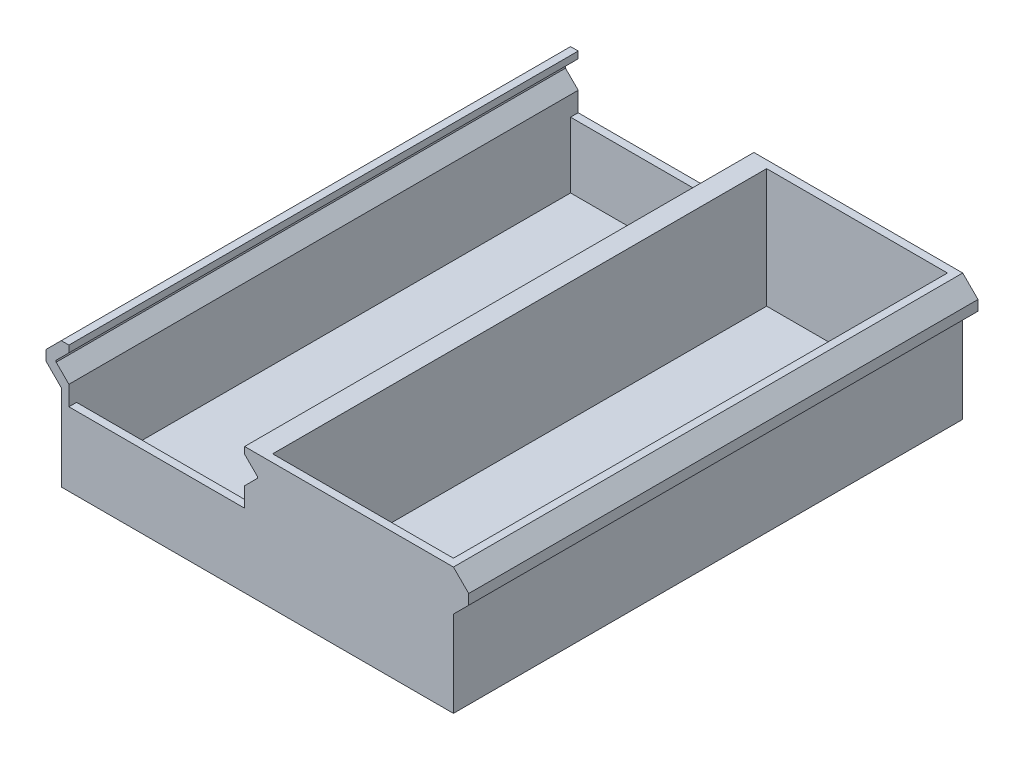
ISO-10303-21;
HEADER;
FILE_DESCRIPTION(('STEP AP214'),'2;1');
FILE_NAME('part.step','',(''),(''),'','','');
FILE_SCHEMA(('AUTOMOTIVE_DESIGN { 1 0 10303 214 1 1 1 1 }'));
ENDSEC;
DATA;
#1=APPLICATION_CONTEXT('core data for automotive mechanical design processes');
#2=APPLICATION_PROTOCOL_DEFINITION('international standard','automotive_design',2000,#1);
#3=PRODUCT_CONTEXT('',#1,'mechanical');
#4=PRODUCT('Part','Part','',(#3));
#5=PRODUCT_RELATED_PRODUCT_CATEGORY('part','',(#4));
#6=PRODUCT_DEFINITION_FORMATION('','',#4);
#7=PRODUCT_DEFINITION_CONTEXT('part definition',#1,'design');
#8=PRODUCT_DEFINITION('design','',#6,#7);
#9=PRODUCT_DEFINITION_SHAPE('','',#8);
#10=(LENGTH_UNIT() NAMED_UNIT(*) SI_UNIT(.MILLI.,.METRE.));
#11=(NAMED_UNIT(*) PLANE_ANGLE_UNIT() SI_UNIT($,.RADIAN.));
#12=(NAMED_UNIT(*) SI_UNIT($,.STERADIAN.) SOLID_ANGLE_UNIT());
#13=UNCERTAINTY_MEASURE_WITH_UNIT(LENGTH_MEASURE(1.E-05),#10,'distance_accuracy_value','');
#14=(GEOMETRIC_REPRESENTATION_CONTEXT(3) GLOBAL_UNCERTAINTY_ASSIGNED_CONTEXT((#13)) GLOBAL_UNIT_ASSIGNED_CONTEXT((#10,
#11,#12)) REPRESENTATION_CONTEXT('',''));
#15=CARTESIAN_POINT('',(0.,0.,0.));
#16=DIRECTION('',(0.,0.,1.));
#17=DIRECTION('',(1.,0.,0.));
#18=AXIS2_PLACEMENT_3D('',#15,#16,#17);
#19=CARTESIAN_POINT('',(-77.,49.7790066638099,-200.));
#20=DIRECTION('',(0.,-1.,0.));
#21=DIRECTION('',(1.,0.,0.));
#22=AXIS2_PLACEMENT_3D('',#19,#20,#21);
#23=PLANE('',#22);
#24=DIRECTION('',(0.,0.,1.));
#25=VECTOR('',#24,1.);
#26=CARTESIAN_POINT('',(3.,49.7790066638099,-3.));
#27=LINE('',#26,#25);
#28=CARTESIAN_POINT('',(3.,49.7790066638099,-197.));
#29=VERTEX_POINT('',#28);
#30=CARTESIAN_POINT('',(3.,49.7790066638099,-3.));
#31=VERTEX_POINT('',#30);
#32=EDGE_CURVE('E251',#29,#31,#27,.T.);
#33=ORIENTED_EDGE('',*,*,#32,.F.);
#34=DIRECTION('',(-1.,0.,0.));
#35=VECTOR('',#34,1.);
#36=CARTESIAN_POINT('',(74.,49.7790066638099,-197.));
#37=LINE('',#36,#35);
#38=CARTESIAN_POINT('',(74.,49.7790066638099,-197.));
#39=VERTEX_POINT('',#38);
#40=EDGE_CURVE('E57',#39,#29,#37,.T.);
#41=ORIENTED_EDGE('',*,*,#40,.F.);
#42=DIRECTION('',(0.,0.,-1.));
#43=VECTOR('',#42,1.);
#44=CARTESIAN_POINT('',(74.,49.7790066638099,-3.));
#45=LINE('',#44,#43);
#46=CARTESIAN_POINT('',(74.,49.7790066638099,-3.));
#47=VERTEX_POINT('',#46);
#48=EDGE_CURVE('E491',#47,#39,#45,.T.);
#49=ORIENTED_EDGE('',*,*,#48,.F.);
#50=DIRECTION('',(1.,0.,0.));
#51=VECTOR('',#50,1.);
#52=CARTESIAN_POINT('',(-74.,49.7790066638099,-3.));
#53=LINE('',#52,#51);
#54=EDGE_CURVE('E250',#31,#47,#53,.T.);
#55=ORIENTED_EDGE('',*,*,#54,.F.);
#56=EDGE_LOOP('',(#33,#41,#49,#55));
#57=FACE_BOUND('',#56,.T.);
#58=DIRECTION('',(1.,0.,0.));
#59=VECTOR('',#58,1.);
#60=CARTESIAN_POINT('',(-77.,49.7790066638099,-200.));
#61=LINE('',#60,#59);
#62=CARTESIAN_POINT('',(-5.,49.7790066638099,-200.));
#63=VERTEX_POINT('',#62);
#64=CARTESIAN_POINT('',(77.,49.77900666381,-200.));
#65=VERTEX_POINT('',#64);
#66=EDGE_CURVE('E271',#63,#65,#61,.T.);
#67=ORIENTED_EDGE('',*,*,#66,.F.);
#68=DIRECTION('',(0.,0.,1.));
#69=VECTOR('',#68,1.);
#70=CARTESIAN_POINT('',(-5.,49.7790066638099,-3.));
#71=LINE('',#70,#69);
#72=CARTESIAN_POINT('',(-5.,49.7790066638099,0.));
#73=VERTEX_POINT('',#72);
#74=EDGE_CURVE('E452',#63,#73,#71,.T.);
#75=ORIENTED_EDGE('',*,*,#74,.T.);
#76=DIRECTION('',(1.,0.,0.));
#77=VECTOR('',#76,1.);
#78=CARTESIAN_POINT('',(-77.,49.7790066638099,0.));
#79=LINE('',#78,#77);
#80=CARTESIAN_POINT('',(77.,49.77900666381,0.));
#81=VERTEX_POINT('',#80);
#82=EDGE_CURVE('E309',#73,#81,#79,.T.);
#83=ORIENTED_EDGE('',*,*,#82,.T.);
#84=DIRECTION('',(0.,0.,1.));
#85=VECTOR('',#84,1.);
#86=CARTESIAN_POINT('',(77.,49.77900666381,-200.));
#87=LINE('',#86,#85);
#88=EDGE_CURVE('E368',#65,#81,#87,.T.);
#89=ORIENTED_EDGE('',*,*,#88,.F.);
#90=EDGE_LOOP('',(#67,#75,#83,#89));
#91=FACE_BOUND('',#90,.T.);
#92=ADVANCED_FACE('F41',(#57,#91),#23,.F.);
#93=CARTESIAN_POINT('',(-5.,243.943885053286,-3.));
#94=DIRECTION('',(-1.,0.,0.));
#95=DIRECTION('',(0.,0.,1.));
#96=AXIS2_PLACEMENT_3D('',#93,#94,#95);
#97=PLANE('',#96);
#98=DIRECTION('',(0.,0.,-1.));
#99=VECTOR('',#98,1.);
#100=CARTESIAN_POINT('',(-5.,47.1221524143175,-3.));
#101=LINE('',#100,#99);
#102=CARTESIAN_POINT('',(-5.,47.1221524143175,0.));
#103=VERTEX_POINT('',#102);
#104=CARTESIAN_POINT('',(-5.,47.1221524143175,-200.));
#105=VERTEX_POINT('',#104);
#106=EDGE_CURVE('E12',#103,#105,#101,.T.);
#107=ORIENTED_EDGE('',*,*,#106,.F.);
#108=DIRECTION('',(0.,1.,0.));
#109=VECTOR('',#108,1.);
#110=CARTESIAN_POINT('',(-5.,47.1221524143175,0.));
#111=LINE('',#110,#109);
#112=EDGE_CURVE('E262',#103,#73,#111,.T.);
#113=ORIENTED_EDGE('',*,*,#112,.T.);
#114=ORIENTED_EDGE('',*,*,#74,.F.);
#115=DIRECTION('',(0.,1.,0.));
#116=VECTOR('',#115,1.);
#117=CARTESIAN_POINT('',(-5.,47.1221524143175,-200.));
#118=LINE('',#117,#116);
#119=EDGE_CURVE('E443',#105,#63,#118,.T.);
#120=ORIENTED_EDGE('',*,*,#119,.F.);
#121=EDGE_LOOP('',(#107,#113,#114,#120));
#122=FACE_BOUND('',#121,.T.);
#123=ADVANCED_FACE('F642',(#122),#97,.T.);
#124=CARTESIAN_POINT('',(74.,-244.008196583639,-197.));
#125=DIRECTION('',(0.,0.,-1.));
#126=DIRECTION('',(-1.,0.,0.));
#127=AXIS2_PLACEMENT_3D('',#124,#125,#126);
#128=PLANE('',#127);
#129=DIRECTION('',(0.,-1.,0.));
#130=VECTOR('',#129,1.);
#131=CARTESIAN_POINT('',(3.,243.943885053286,-197.));
#132=LINE('',#131,#130);
#133=CARTESIAN_POINT('',(3.,2.99999999999999,-197.));
#134=VERTEX_POINT('',#133);
#135=EDGE_CURVE('E455',#29,#134,#132,.T.);
#136=ORIENTED_EDGE('',*,*,#135,.T.);
#137=DIRECTION('',(1.,0.,0.));
#138=VECTOR('',#137,1.);
#139=CARTESIAN_POINT('',(74.,3.,-197.));
#140=LINE('',#139,#138);
#141=CARTESIAN_POINT('',(74.,3.,-197.));
#142=VERTEX_POINT('',#141);
#143=EDGE_CURVE('E479',#134,#142,#140,.T.);
#144=ORIENTED_EDGE('',*,*,#143,.T.);
#145=DIRECTION('',(0.,1.,0.));
#146=VECTOR('',#145,1.);
#147=CARTESIAN_POINT('',(74.,-244.008196583639,-197.));
#148=LINE('',#147,#146);
#149=EDGE_CURVE('E501',#142,#39,#148,.T.);
#150=ORIENTED_EDGE('',*,*,#149,.T.);
#151=ORIENTED_EDGE('',*,*,#40,.T.);
#152=EDGE_LOOP('',(#136,#144,#150,#151));
#153=FACE_BOUND('',#152,.T.);
#154=ADVANCED_FACE('F673',(#153),#128,.F.);
#155=CARTESIAN_POINT('',(-73.9999999999999,-244.008196583639,-3.));
#156=DIRECTION('',(0.,0.,1.));
#157=DIRECTION('',(1.,0.,0.));
#158=AXIS2_PLACEMENT_3D('',#155,#156,#157);
#159=PLANE('',#158);
#160=DIRECTION('',(0.,-1.,0.));
#161=VECTOR('',#160,1.);
#162=CARTESIAN_POINT('',(3.,243.943885053286,-3.));
#163=LINE('',#162,#161);
#164=CARTESIAN_POINT('',(3.,2.99999999999998,-3.));
#165=VERTEX_POINT('',#164);
#166=EDGE_CURVE('E65',#31,#165,#163,.T.);
#167=ORIENTED_EDGE('',*,*,#166,.F.);
#168=ORIENTED_EDGE('',*,*,#54,.T.);
#169=DIRECTION('',(0.,1.,0.));
#170=VECTOR('',#169,1.);
#171=CARTESIAN_POINT('',(74.,-244.008196583639,-3.));
#172=LINE('',#171,#170);
#173=CARTESIAN_POINT('',(74.,2.99999999999998,-3.));
#174=VERTEX_POINT('',#173);
#175=EDGE_CURVE('E504',#174,#47,#172,.T.);
#176=ORIENTED_EDGE('',*,*,#175,.F.);
#177=DIRECTION('',(-1.,0.,0.));
#178=VECTOR('',#177,1.);
#179=CARTESIAN_POINT('',(-74.,2.99999999999998,-3.));
#180=LINE('',#179,#178);
#181=EDGE_CURVE('E310',#174,#165,#180,.T.);
#182=ORIENTED_EDGE('',*,*,#181,.T.);
#183=EDGE_LOOP('',(#167,#168,#176,#182));
#184=FACE_BOUND('',#183,.T.);
#185=ADVANCED_FACE('F685',(#184),#159,.F.);
#186=CARTESIAN_POINT('',(77.,3.,-200.));
#187=DIRECTION('',(0.,1.,0.));
#188=DIRECTION('',(-1.,0.,0.));
#189=AXIS2_PLACEMENT_3D('',#186,#187,#188);
#190=PLANE('',#189);
#191=ORIENTED_EDGE('',*,*,#143,.F.);
#192=DIRECTION('',(0.,0.,-1.));
#193=VECTOR('',#192,1.);
#194=CARTESIAN_POINT('',(3.,2.99999999999999,-3.));
#195=LINE('',#194,#193);
#196=EDGE_CURVE('E451',#165,#134,#195,.T.);
#197=ORIENTED_EDGE('',*,*,#196,.F.);
#198=ORIENTED_EDGE('',*,*,#181,.F.);
#199=DIRECTION('',(0.,0.,1.));
#200=VECTOR('',#199,1.);
#201=CARTESIAN_POINT('',(74.,3.,-3.));
#202=LINE('',#201,#200);
#203=EDGE_CURVE('E476',#142,#174,#202,.T.);
#204=ORIENTED_EDGE('',*,*,#203,.F.);
#205=EDGE_LOOP('',(#191,#197,#198,#204));
#206=FACE_BOUND('',#205,.T.);
#207=ADVANCED_FACE('F681',(#206),#190,.T.);
#208=CARTESIAN_POINT('',(-83.,43.7790066638099,-200.));
#209=DIRECTION('',(0.707106781186549,-0.707106781186546,0.));
#210=DIRECTION('',(0.707106781186546,0.707106781186549,0.));
#211=AXIS2_PLACEMENT_3D('',#208,#209,#210);
#212=PLANE('',#211);
#213=DIRECTION('',(0.707106781186546,0.707106781186549,0.));
#214=VECTOR('',#213,1.);
#215=CARTESIAN_POINT('',(-83.,43.7790066638099,0.));
#216=LINE('',#215,#214);
#217=CARTESIAN_POINT('',(-83.,43.7790066638099,0.));
#218=VERTEX_POINT('',#217);
#219=CARTESIAN_POINT('',(-77.,49.7790066638099,0.));
#220=VERTEX_POINT('',#219);
#221=EDGE_CURVE('E305',#218,#220,#216,.T.);
#222=ORIENTED_EDGE('',*,*,#221,.T.);
#223=DIRECTION('',(0.,0.,1.));
#224=VECTOR('',#223,1.);
#225=CARTESIAN_POINT('',(-77.,49.7790066638099,-200.));
#226=LINE('',#225,#224);
#227=CARTESIAN_POINT('',(-77.,49.7790066638099,-200.));
#228=VERTEX_POINT('',#227);
#229=EDGE_CURVE('E372',#228,#220,#226,.T.);
#230=ORIENTED_EDGE('',*,*,#229,.F.);
#231=DIRECTION('',(0.707106781186546,0.707106781186549,0.));
#232=VECTOR('',#231,1.);
#233=CARTESIAN_POINT('',(-83.,43.7790066638099,-200.));
#234=LINE('',#233,#232);
#235=CARTESIAN_POINT('',(-83.,43.7790066638099,-200.));
#236=VERTEX_POINT('',#235);
#237=EDGE_CURVE('E267',#236,#228,#234,.T.);
#238=ORIENTED_EDGE('',*,*,#237,.F.);
#239=DIRECTION('',(0.,0.,1.));
#240=VECTOR('',#239,1.);
#241=CARTESIAN_POINT('',(-83.,43.7790066638099,-200.));
#242=LINE('',#241,#240);
#243=EDGE_CURVE('E304',#236,#218,#242,.T.);
#244=ORIENTED_EDGE('',*,*,#243,.T.);
#245=EDGE_LOOP('',(#222,#230,#238,#244));
#246=FACE_BOUND('',#245,.T.);
#247=ADVANCED_FACE('F43',(#246),#212,.F.);
#248=CARTESIAN_POINT('',(-74.,49.7790066638099,0.));
#249=VERTEX_POINT('',#248);
#250=EDGE_CURVE('E245',#220,#249,#79,.T.);
#251=ORIENTED_EDGE('',*,*,#250,.T.);
#252=DIRECTION('',(0.,0.,1.));
#253=VECTOR('',#252,1.);
#254=CARTESIAN_POINT('',(-74.,49.7790066638099,-197.));
#255=LINE('',#254,#253);
#256=CARTESIAN_POINT('',(-74.,49.7790066638099,-200.));
#257=VERTEX_POINT('',#256);
#258=EDGE_CURVE('E238',#257,#249,#255,.T.);
#259=ORIENTED_EDGE('',*,*,#258,.F.);
#260=EDGE_CURVE('E243',#228,#257,#61,.T.);
#261=ORIENTED_EDGE('',*,*,#260,.F.);
#262=ORIENTED_EDGE('',*,*,#229,.T.);
#263=EDGE_LOOP('',(#251,#259,#261,#262));
#264=FACE_BOUND('',#263,.T.);
#265=ADVANCED_FACE('F240',(#264),#23,.F.);
#266=CARTESIAN_POINT('',(83.,43.7790066638099,-200.));
#267=DIRECTION('',(0.707106781186549,0.707106781186546,0.));
#268=DIRECTION('',(-0.707106781186546,0.707106781186549,0.));
#269=AXIS2_PLACEMENT_3D('',#266,#267,#268);
#270=PLANE('',#269);
#271=DIRECTION('',(-0.707106781186546,0.707106781186549,0.));
#272=VECTOR('',#271,1.);
#273=CARTESIAN_POINT('',(83.,43.7790066638099,0.));
#274=LINE('',#273,#272);
#275=CARTESIAN_POINT('',(83.,43.7790066638099,0.));
#276=VERTEX_POINT('',#275);
#277=EDGE_CURVE('E313',#276,#81,#274,.T.);
#278=ORIENTED_EDGE('',*,*,#277,.F.);
#279=DIRECTION('',(0.,0.,1.));
#280=VECTOR('',#279,1.);
#281=CARTESIAN_POINT('',(83.,43.7790066638099,-200.));
#282=LINE('',#281,#280);
#283=CARTESIAN_POINT('',(83.,43.7790066638099,-200.));
#284=VERTEX_POINT('',#283);
#285=EDGE_CURVE('E365',#284,#276,#282,.T.);
#286=ORIENTED_EDGE('',*,*,#285,.F.);
#287=DIRECTION('',(-0.707106781186546,0.707106781186549,0.));
#288=VECTOR('',#287,1.);
#289=CARTESIAN_POINT('',(83.,43.7790066638099,-200.));
#290=LINE('',#289,#288);
#291=EDGE_CURVE('E270',#284,#65,#290,.T.);
#292=ORIENTED_EDGE('',*,*,#291,.T.);
#293=ORIENTED_EDGE('',*,*,#88,.T.);
#294=EDGE_LOOP('',(#278,#286,#292,#293));
#295=FACE_BOUND('',#294,.T.);
#296=ADVANCED_FACE('F635',(#295),#270,.T.);
#297=CARTESIAN_POINT('',(83.,39.7790066638099,-200.));
#298=DIRECTION('',(1.,0.,0.));
#299=DIRECTION('',(0.,0.,-1.));
#300=AXIS2_PLACEMENT_3D('',#297,#298,#299);
#301=PLANE('',#300);
#302=DIRECTION('',(0.,1.,0.));
#303=VECTOR('',#302,1.);
#304=CARTESIAN_POINT('',(83.,39.7790066638099,0.));
#305=LINE('',#304,#303);
#306=CARTESIAN_POINT('',(83.,39.7790066638099,0.));
#307=VERTEX_POINT('',#306);
#308=EDGE_CURVE('E317',#307,#276,#305,.T.);
#309=ORIENTED_EDGE('',*,*,#308,.F.);
#310=DIRECTION('',(0.,0.,1.));
#311=VECTOR('',#310,1.);
#312=CARTESIAN_POINT('',(83.,39.7790066638099,-200.));
#313=LINE('',#312,#311);
#314=CARTESIAN_POINT('',(83.,39.7790066638099,-200.));
#315=VERTEX_POINT('',#314);
#316=EDGE_CURVE('E362',#315,#307,#313,.T.);
#317=ORIENTED_EDGE('',*,*,#316,.F.);
#318=DIRECTION('',(0.,1.,0.));
#319=VECTOR('',#318,1.);
#320=CARTESIAN_POINT('',(83.,39.7790066638099,-200.));
#321=LINE('',#320,#319);
#322=EDGE_CURVE('E276',#315,#284,#321,.T.);
#323=ORIENTED_EDGE('',*,*,#322,.T.);
#324=ORIENTED_EDGE('',*,*,#285,.T.);
#325=EDGE_LOOP('',(#309,#317,#323,#324));
#326=FACE_BOUND('',#325,.T.);
#327=ADVANCED_FACE('F631',(#326),#301,.T.);
#328=CARTESIAN_POINT('',(77.,33.77900666381,-200.));
#329=DIRECTION('',(0.707106781186546,-0.707106781186549,0.));
#330=DIRECTION('',(0.707106781186549,0.707106781186546,0.));
#331=AXIS2_PLACEMENT_3D('',#328,#329,#330);
#332=PLANE('',#331);
#333=DIRECTION('',(0.707106781186549,0.707106781186546,0.));
#334=VECTOR('',#333,1.);
#335=CARTESIAN_POINT('',(77.,33.77900666381,0.));
#336=LINE('',#335,#334);
#337=CARTESIAN_POINT('',(77.,33.77900666381,0.));
#338=VERTEX_POINT('',#337);
#339=EDGE_CURVE('E321',#338,#307,#336,.T.);
#340=ORIENTED_EDGE('',*,*,#339,.F.);
#341=DIRECTION('',(0.,0.,1.));
#342=VECTOR('',#341,1.);
#343=CARTESIAN_POINT('',(77.,33.77900666381,-200.));
#344=LINE('',#343,#342);
#345=CARTESIAN_POINT('',(77.,33.77900666381,-200.));
#346=VERTEX_POINT('',#345);
#347=EDGE_CURVE('E359',#346,#338,#344,.T.);
#348=ORIENTED_EDGE('',*,*,#347,.F.);
#349=DIRECTION('',(0.707106781186549,0.707106781186546,0.));
#350=VECTOR('',#349,1.);
#351=CARTESIAN_POINT('',(77.,33.77900666381,-200.));
#352=LINE('',#351,#350);
#353=EDGE_CURVE('E284',#346,#315,#352,.T.);
#354=ORIENTED_EDGE('',*,*,#353,.T.);
#355=ORIENTED_EDGE('',*,*,#316,.T.);
#356=EDGE_LOOP('',(#340,#348,#354,#355));
#357=FACE_BOUND('',#356,.T.);
#358=ADVANCED_FACE('F626',(#357),#332,.T.);
#359=CARTESIAN_POINT('',(77.,0.,-200.));
#360=DIRECTION('',(1.,0.,0.));
#361=DIRECTION('',(0.,0.,-1.));
#362=AXIS2_PLACEMENT_3D('',#359,#360,#361);
#363=PLANE('',#362);
#364=DIRECTION('',(0.,1.,0.));
#365=VECTOR('',#364,1.);
#366=CARTESIAN_POINT('',(77.,0.,0.));
#367=LINE('',#366,#365);
#368=CARTESIAN_POINT('',(77.,0.,0.));
#369=VERTEX_POINT('',#368);
#370=EDGE_CURVE('E325',#369,#338,#367,.T.);
#371=ORIENTED_EDGE('',*,*,#370,.F.);
#372=DIRECTION('',(0.,0.,1.));
#373=VECTOR('',#372,1.);
#374=CARTESIAN_POINT('',(77.,0.,-200.));
#375=LINE('',#374,#373);
#376=CARTESIAN_POINT('',(77.,0.,-200.));
#377=VERTEX_POINT('',#376);
#378=EDGE_CURVE('E356',#377,#369,#375,.T.);
#379=ORIENTED_EDGE('',*,*,#378,.F.);
#380=DIRECTION('',(0.,1.,0.));
#381=VECTOR('',#380,1.);
#382=CARTESIAN_POINT('',(77.,0.,-200.));
#383=LINE('',#382,#381);
#384=EDGE_CURVE('E288',#377,#346,#383,.T.);
#385=ORIENTED_EDGE('',*,*,#384,.T.);
#386=ORIENTED_EDGE('',*,*,#347,.T.);
#387=EDGE_LOOP('',(#371,#379,#385,#386));
#388=FACE_BOUND('',#387,.T.);
#389=ADVANCED_FACE('F622',(#388),#363,.T.);
#390=CARTESIAN_POINT('',(77.,0.,-200.));
#391=DIRECTION('',(0.,1.,0.));
#392=DIRECTION('',(-1.,0.,0.));
#393=AXIS2_PLACEMENT_3D('',#390,#391,#392);
#394=PLANE('',#393);
#395=DIRECTION('',(-1.,0.,0.));
#396=VECTOR('',#395,1.);
#397=CARTESIAN_POINT('',(77.,0.,0.));
#398=LINE('',#397,#396);
#399=CARTESIAN_POINT('',(-77.,0.,0.));
#400=VERTEX_POINT('',#399);
#401=EDGE_CURVE('E329',#369,#400,#398,.T.);
#402=ORIENTED_EDGE('',*,*,#401,.T.);
#403=DIRECTION('',(0.,0.,1.));
#404=VECTOR('',#403,1.);
#405=CARTESIAN_POINT('',(-77.,0.,-200.));
#406=LINE('',#405,#404);
#407=CARTESIAN_POINT('',(-77.,0.,-200.));
#408=VERTEX_POINT('',#407);
#409=EDGE_CURVE('E352',#408,#400,#406,.T.);
#410=ORIENTED_EDGE('',*,*,#409,.F.);
#411=DIRECTION('',(-1.,0.,0.));
#412=VECTOR('',#411,1.);
#413=CARTESIAN_POINT('',(77.,0.,-200.));
#414=LINE('',#413,#412);
#415=EDGE_CURVE('E292',#377,#408,#414,.T.);
#416=ORIENTED_EDGE('',*,*,#415,.F.);
#417=ORIENTED_EDGE('',*,*,#378,.T.);
#418=EDGE_LOOP('',(#402,#410,#416,#417));
#419=FACE_BOUND('',#418,.T.);
#420=ADVANCED_FACE('F618',(#419),#394,.F.);
#421=CARTESIAN_POINT('',(-77.,0.,-200.));
#422=DIRECTION('',(1.,0.,0.));
#423=DIRECTION('',(0.,0.,-1.));
#424=AXIS2_PLACEMENT_3D('',#421,#422,#423);
#425=PLANE('',#424);
#426=DIRECTION('',(0.,1.,0.));
#427=VECTOR('',#426,1.);
#428=CARTESIAN_POINT('',(-77.,0.,0.));
#429=LINE('',#428,#427);
#430=CARTESIAN_POINT('',(-77.,33.7790066638099,0.));
#431=VERTEX_POINT('',#430);
#432=EDGE_CURVE('E332',#400,#431,#429,.T.);
#433=ORIENTED_EDGE('',*,*,#432,.T.);
#434=DIRECTION('',(0.,0.,1.));
#435=VECTOR('',#434,1.);
#436=CARTESIAN_POINT('',(-77.,33.7790066638099,-200.));
#437=LINE('',#436,#435);
#438=CARTESIAN_POINT('',(-77.,33.7790066638099,-200.));
#439=VERTEX_POINT('',#438);
#440=EDGE_CURVE('E348',#439,#431,#437,.T.);
#441=ORIENTED_EDGE('',*,*,#440,.F.);
#442=DIRECTION('',(0.,1.,0.));
#443=VECTOR('',#442,1.);
#444=CARTESIAN_POINT('',(-77.,0.,-200.));
#445=LINE('',#444,#443);
#446=EDGE_CURVE('E295',#408,#439,#445,.T.);
#447=ORIENTED_EDGE('',*,*,#446,.F.);
#448=ORIENTED_EDGE('',*,*,#409,.T.);
#449=EDGE_LOOP('',(#433,#441,#447,#448));
#450=FACE_BOUND('',#449,.T.);
#451=ADVANCED_FACE('F614',(#450),#425,.F.);
#452=CARTESIAN_POINT('',(-77.,33.7790066638099,-200.));
#453=DIRECTION('',(0.707106781186546,0.707106781186549,0.));
#454=DIRECTION('',(-0.707106781186549,0.707106781186546,0.));
#455=AXIS2_PLACEMENT_3D('',#452,#453,#454);
#456=PLANE('',#455);
#457=DIRECTION('',(-0.707106781186549,0.707106781186546,0.));
#458=VECTOR('',#457,1.);
#459=CARTESIAN_POINT('',(-77.,33.7790066638099,0.));
#460=LINE('',#459,#458);
#461=CARTESIAN_POINT('',(-83.,39.7790066638099,0.));
#462=VERTEX_POINT('',#461);
#463=EDGE_CURVE('E335',#431,#462,#460,.T.);
#464=ORIENTED_EDGE('',*,*,#463,.T.);
#465=DIRECTION('',(0.,0.,1.));
#466=VECTOR('',#465,1.);
#467=CARTESIAN_POINT('',(-83.,39.7790066638099,-200.));
#468=LINE('',#467,#466);
#469=CARTESIAN_POINT('',(-83.,39.7790066638099,-200.));
#470=VERTEX_POINT('',#469);
#471=EDGE_CURVE('E344',#470,#462,#468,.T.);
#472=ORIENTED_EDGE('',*,*,#471,.F.);
#473=DIRECTION('',(-0.707106781186549,0.707106781186546,0.));
#474=VECTOR('',#473,1.);
#475=CARTESIAN_POINT('',(-77.,33.7790066638099,-200.));
#476=LINE('',#475,#474);
#477=EDGE_CURVE('E298',#439,#470,#476,.T.);
#478=ORIENTED_EDGE('',*,*,#477,.F.);
#479=ORIENTED_EDGE('',*,*,#440,.T.);
#480=EDGE_LOOP('',(#464,#472,#478,#479));
#481=FACE_BOUND('',#480,.T.);
#482=ADVANCED_FACE('F609',(#481),#456,.F.);
#483=CARTESIAN_POINT('',(-83.,39.7790066638099,-200.));
#484=DIRECTION('',(1.,0.,0.));
#485=DIRECTION('',(0.,0.,-1.));
#486=AXIS2_PLACEMENT_3D('',#483,#484,#485);
#487=PLANE('',#486);
#488=DIRECTION('',(0.,1.,0.));
#489=VECTOR('',#488,1.);
#490=CARTESIAN_POINT('',(-83.,39.7790066638099,0.));
#491=LINE('',#490,#489);
#492=EDGE_CURVE('E338',#462,#218,#491,.T.);
#493=ORIENTED_EDGE('',*,*,#492,.T.);
#494=ORIENTED_EDGE('',*,*,#243,.F.);
#495=DIRECTION('',(0.,1.,0.));
#496=VECTOR('',#495,1.);
#497=CARTESIAN_POINT('',(-83.,39.7790066638099,-200.));
#498=LINE('',#497,#496);
#499=EDGE_CURVE('E301',#470,#236,#498,.T.);
#500=ORIENTED_EDGE('',*,*,#499,.F.);
#501=ORIENTED_EDGE('',*,*,#471,.T.);
#502=EDGE_LOOP('',(#493,#494,#500,#501));
#503=FACE_BOUND('',#502,.T.);
#504=ADVANCED_FACE('F603',(#503),#487,.F.);
#505=CARTESIAN_POINT('',(0.,0.,-200.));
#506=DIRECTION('',(0.,0.,1.));
#507=DIRECTION('',(1.,0.,0.));
#508=AXIS2_PLACEMENT_3D('',#505,#506,#507);
#509=PLANE('',#508);
#510=DIRECTION('',(-0.707106781186548,0.707106781186547,0.));
#511=VECTOR('',#510,1.);
#512=CARTESIAN_POINT('',(0.,42.1221524143175,-200.));
#513=LINE('',#512,#511);
#514=CARTESIAN_POINT('',(0.,42.1221524143175,-200.));
#515=VERTEX_POINT('',#514);
#516=EDGE_CURVE('E536',#515,#105,#513,.T.);
#517=ORIENTED_EDGE('',*,*,#516,.T.);
#518=ORIENTED_EDGE('',*,*,#119,.T.);
#519=ORIENTED_EDGE('',*,*,#66,.T.);
#520=ORIENTED_EDGE('',*,*,#291,.F.);
#521=ORIENTED_EDGE('',*,*,#322,.F.);
#522=ORIENTED_EDGE('',*,*,#353,.F.);
#523=ORIENTED_EDGE('',*,*,#384,.F.);
#524=ORIENTED_EDGE('',*,*,#415,.T.);
#525=ORIENTED_EDGE('',*,*,#446,.T.);
#526=ORIENTED_EDGE('',*,*,#477,.T.);
#527=ORIENTED_EDGE('',*,*,#499,.T.);
#528=ORIENTED_EDGE('',*,*,#237,.T.);
#529=ORIENTED_EDGE('',*,*,#260,.T.);
#530=DIRECTION('',(0.,-1.,0.));
#531=VECTOR('',#530,1.);
#532=CARTESIAN_POINT('',(-74.,49.7790066638099,-200.));
#533=LINE('',#532,#531);
#534=CARTESIAN_POINT('',(-74.,47.1221524143175,-200.));
#535=VERTEX_POINT('',#534);
#536=EDGE_CURVE('E254',#257,#535,#533,.T.);
#537=ORIENTED_EDGE('',*,*,#536,.T.);
#538=DIRECTION('',(-0.707106781186547,-0.707106781186547,0.));
#539=VECTOR('',#538,1.);
#540=CARTESIAN_POINT('',(-74.,47.1221524143175,-200.));
#541=LINE('',#540,#539);
#542=CARTESIAN_POINT('',(-79.,42.1221524143175,-200.));
#543=VERTEX_POINT('',#542);
#544=EDGE_CURVE('E261',#535,#543,#541,.T.);
#545=ORIENTED_EDGE('',*,*,#544,.T.);
#546=DIRECTION('',(0.,-1.,0.));
#547=VECTOR('',#546,1.);
#548=CARTESIAN_POINT('',(-79.,42.1221524143175,-200.));
#549=LINE('',#548,#547);
#550=CARTESIAN_POINT('',(-79.,41.4358609133023,-200.));
#551=VERTEX_POINT('',#550);
#552=EDGE_CURVE('E560',#543,#551,#549,.T.);
#553=ORIENTED_EDGE('',*,*,#552,.T.);
#554=DIRECTION('',(0.707106781186548,-0.707106781186547,0.));
#555=VECTOR('',#554,1.);
#556=CARTESIAN_POINT('',(-79.,41.4358609133023,-200.));
#557=LINE('',#556,#555);
#558=CARTESIAN_POINT('',(-74.,36.4358609133023,-200.));
#559=VERTEX_POINT('',#558);
#560=EDGE_CURVE('E556',#551,#559,#557,.T.);
#561=ORIENTED_EDGE('',*,*,#560,.T.);
#562=DIRECTION('',(0.,-1.,0.));
#563=VECTOR('',#562,1.);
#564=CARTESIAN_POINT('',(-74.,36.4358609133023,-200.));
#565=LINE('',#564,#563);
#566=CARTESIAN_POINT('',(-74.,28.7790066638099,-200.));
#567=VERTEX_POINT('',#566);
#568=EDGE_CURVE('E552',#559,#567,#565,.T.);
#569=ORIENTED_EDGE('',*,*,#568,.T.);
#570=DIRECTION('',(1.,0.,0.));
#571=VECTOR('',#570,1.);
#572=CARTESIAN_POINT('',(-74.,28.7790066638099,-200.));
#573=LINE('',#572,#571);
#574=CARTESIAN_POINT('',(-5.,28.7790066638099,-200.));
#575=VERTEX_POINT('',#574);
#576=EDGE_CURVE('E548',#567,#575,#573,.T.);
#577=ORIENTED_EDGE('',*,*,#576,.T.);
#578=DIRECTION('',(0.,1.,0.));
#579=VECTOR('',#578,1.);
#580=CARTESIAN_POINT('',(-5.,28.7790066638099,-200.));
#581=LINE('',#580,#579);
#582=CARTESIAN_POINT('',(-5.,36.4358609133023,-200.));
#583=VERTEX_POINT('',#582);
#584=EDGE_CURVE('E545',#575,#583,#581,.T.);
#585=ORIENTED_EDGE('',*,*,#584,.T.);
#586=DIRECTION('',(0.707106781186547,0.707106781186548,0.));
#587=VECTOR('',#586,1.);
#588=CARTESIAN_POINT('',(-5.,36.4358609133023,-200.));
#589=LINE('',#588,#587);
#590=CARTESIAN_POINT('',(0.,41.4358609133023,-200.));
#591=VERTEX_POINT('',#590);
#592=EDGE_CURVE('E384',#583,#591,#589,.T.);
#593=ORIENTED_EDGE('',*,*,#592,.T.);
#594=DIRECTION('',(0.,1.,0.));
#595=VECTOR('',#594,1.);
#596=CARTESIAN_POINT('',(0.,41.4358609133023,-200.));
#597=LINE('',#596,#595);
#598=EDGE_CURVE('E539',#591,#515,#597,.T.);
#599=ORIENTED_EDGE('',*,*,#598,.T.);
#600=EDGE_LOOP('',(#517,#518,#519,#520,#521,#522,#523,#524,#525,#526,#527,#528,#529,#537,#545,
#553,#561,#569,#577,#585,#593,#599));
#601=FACE_BOUND('',#600,.T.);
#602=ADVANCED_FACE('F265',(#601),#509,.F.);
#603=CARTESIAN_POINT('',(0.,0.,0.));
#604=DIRECTION('',(0.,0.,1.));
#605=DIRECTION('',(1.,0.,0.));
#606=AXIS2_PLACEMENT_3D('',#603,#604,#605);
#607=PLANE('',#606);
#608=ORIENTED_EDGE('',*,*,#112,.F.);
#609=DIRECTION('',(-0.707106781186548,0.707106781186547,0.));
#610=VECTOR('',#609,1.);
#611=CARTESIAN_POINT('',(0.,42.1221524143175,0.));
#612=LINE('',#611,#610);
#613=CARTESIAN_POINT('',(0.,42.1221524143175,0.));
#614=VERTEX_POINT('',#613);
#615=EDGE_CURVE('E407',#614,#103,#612,.T.);
#616=ORIENTED_EDGE('',*,*,#615,.F.);
#617=DIRECTION('',(0.,1.,0.));
#618=VECTOR('',#617,1.);
#619=CARTESIAN_POINT('',(0.,41.4358609133023,0.));
#620=LINE('',#619,#618);
#621=CARTESIAN_POINT('',(0.,41.4358609133023,0.));
#622=VERTEX_POINT('',#621);
#623=EDGE_CURVE('E403',#622,#614,#620,.T.);
#624=ORIENTED_EDGE('',*,*,#623,.F.);
#625=DIRECTION('',(0.707106781186547,0.707106781186548,0.));
#626=VECTOR('',#625,1.);
#627=CARTESIAN_POINT('',(-5.,36.4358609133023,0.));
#628=LINE('',#627,#626);
#629=CARTESIAN_POINT('',(-5.,36.4358609133023,0.));
#630=VERTEX_POINT('',#629);
#631=EDGE_CURVE('E381',#630,#622,#628,.T.);
#632=ORIENTED_EDGE('',*,*,#631,.F.);
#633=DIRECTION('',(0.,1.,0.));
#634=VECTOR('',#633,1.);
#635=CARTESIAN_POINT('',(-5.,28.7790066638099,0.));
#636=LINE('',#635,#634);
#637=CARTESIAN_POINT('',(-5.,28.7790066638099,0.));
#638=VERTEX_POINT('',#637);
#639=EDGE_CURVE('E389',#638,#630,#636,.T.);
#640=ORIENTED_EDGE('',*,*,#639,.F.);
#641=DIRECTION('',(1.,0.,0.));
#642=VECTOR('',#641,1.);
#643=CARTESIAN_POINT('',(-74.,28.7790066638099,0.));
#644=LINE('',#643,#642);
#645=CARTESIAN_POINT('',(-74.,28.7790066638099,0.));
#646=VERTEX_POINT('',#645);
#647=EDGE_CURVE('E397',#646,#638,#644,.T.);
#648=ORIENTED_EDGE('',*,*,#647,.F.);
#649=DIRECTION('',(0.,-1.,0.));
#650=VECTOR('',#649,1.);
#651=CARTESIAN_POINT('',(-74.,36.4358609133023,0.));
#652=LINE('',#651,#650);
#653=CARTESIAN_POINT('',(-74.,36.4358609133023,0.));
#654=VERTEX_POINT('',#653);
#655=EDGE_CURVE('E529',#654,#646,#652,.T.);
#656=ORIENTED_EDGE('',*,*,#655,.F.);
#657=DIRECTION('',(0.707106781186548,-0.707106781186547,0.));
#658=VECTOR('',#657,1.);
#659=CARTESIAN_POINT('',(-79.,41.4358609133023,0.));
#660=LINE('',#659,#658);
#661=CARTESIAN_POINT('',(-79.,41.4358609133023,0.));
#662=VERTEX_POINT('',#661);
#663=EDGE_CURVE('E578',#662,#654,#660,.T.);
#664=ORIENTED_EDGE('',*,*,#663,.F.);
#665=DIRECTION('',(0.,-1.,0.));
#666=VECTOR('',#665,1.);
#667=CARTESIAN_POINT('',(-79.,42.1221524143175,0.));
#668=LINE('',#667,#666);
#669=CARTESIAN_POINT('',(-79.,42.1221524143175,0.));
#670=VERTEX_POINT('',#669);
#671=EDGE_CURVE('E574',#670,#662,#668,.T.);
#672=ORIENTED_EDGE('',*,*,#671,.F.);
#673=DIRECTION('',(-0.707106781186547,-0.707106781186547,0.));
#674=VECTOR('',#673,1.);
#675=CARTESIAN_POINT('',(-74.,47.1221524143175,0.));
#676=LINE('',#675,#674);
#677=CARTESIAN_POINT('',(-74.,47.1221524143175,0.));
#678=VERTEX_POINT('',#677);
#679=EDGE_CURVE('E570',#678,#670,#676,.T.);
#680=ORIENTED_EDGE('',*,*,#679,.F.);
#681=DIRECTION('',(0.,-1.,0.));
#682=VECTOR('',#681,1.);
#683=CARTESIAN_POINT('',(-74.,49.7790066638099,0.));
#684=LINE('',#683,#682);
#685=EDGE_CURVE('E567',#249,#678,#684,.T.);
#686=ORIENTED_EDGE('',*,*,#685,.F.);
#687=ORIENTED_EDGE('',*,*,#250,.F.);
#688=ORIENTED_EDGE('',*,*,#221,.F.);
#689=ORIENTED_EDGE('',*,*,#492,.F.);
#690=ORIENTED_EDGE('',*,*,#463,.F.);
#691=ORIENTED_EDGE('',*,*,#432,.F.);
#692=ORIENTED_EDGE('',*,*,#401,.F.);
#693=ORIENTED_EDGE('',*,*,#370,.T.);
#694=ORIENTED_EDGE('',*,*,#339,.T.);
#695=ORIENTED_EDGE('',*,*,#308,.T.);
#696=ORIENTED_EDGE('',*,*,#277,.T.);
#697=ORIENTED_EDGE('',*,*,#82,.F.);
#698=EDGE_LOOP('',(#608,#616,#624,#632,#640,#648,#656,#664,#672,#680,#686,#687,#688,#689,#690,
#691,#692,#693,#694,#695,#696,#697));
#699=FACE_BOUND('',#698,.T.);
#700=ADVANCED_FACE('F400',(#699),#607,.T.);
#701=CARTESIAN_POINT('',(-73.9999999999999,-244.008196583639,-197.));
#702=DIRECTION('',(-1.,0.,0.));
#703=DIRECTION('',(0.,-1.,0.));
#704=AXIS2_PLACEMENT_3D('',#701,#702,#703);
#705=PLANE('',#704);
#706=ORIENTED_EDGE('',*,*,#258,.T.);
#707=ORIENTED_EDGE('',*,*,#685,.T.);
#708=DIRECTION('',(0.,0.,1.));
#709=VECTOR('',#708,1.);
#710=CARTESIAN_POINT('',(-74.,47.1221524143175,-200.));
#711=LINE('',#710,#709);
#712=EDGE_CURVE('E256',#535,#678,#711,.T.);
#713=ORIENTED_EDGE('',*,*,#712,.F.);
#714=ORIENTED_EDGE('',*,*,#536,.F.);
#715=EDGE_LOOP('',(#706,#707,#713,#714));
#716=FACE_BOUND('',#715,.T.);
#717=ADVANCED_FACE('F255',(#716),#705,.F.);
#718=CARTESIAN_POINT('',(74.,-244.008196583639,-3.));
#719=DIRECTION('',(1.,0.,0.));
#720=DIRECTION('',(0.,1.,0.));
#721=AXIS2_PLACEMENT_3D('',#718,#719,#720);
#722=PLANE('',#721);
#723=ORIENTED_EDGE('',*,*,#203,.T.);
#724=ORIENTED_EDGE('',*,*,#175,.T.);
#725=ORIENTED_EDGE('',*,*,#48,.T.);
#726=ORIENTED_EDGE('',*,*,#149,.F.);
#727=EDGE_LOOP('',(#723,#724,#725,#726));
#728=FACE_BOUND('',#727,.T.);
#729=ADVANCED_FACE('F663',(#728),#722,.F.);
#730=CARTESIAN_POINT('',(3.,243.943885053286,-3.));
#731=DIRECTION('',(-1.,0.,0.));
#732=DIRECTION('',(0.,0.,1.));
#733=AXIS2_PLACEMENT_3D('',#730,#731,#732);
#734=PLANE('',#733);
#735=ORIENTED_EDGE('',*,*,#135,.F.);
#736=ORIENTED_EDGE('',*,*,#32,.T.);
#737=ORIENTED_EDGE('',*,*,#166,.T.);
#738=ORIENTED_EDGE('',*,*,#196,.T.);
#739=EDGE_LOOP('',(#735,#736,#737,#738));
#740=FACE_BOUND('',#739,.T.);
#741=ADVANCED_FACE('F657',(#740),#734,.F.);
#742=CARTESIAN_POINT('',(-74.,28.7790066638099,-200.));
#743=DIRECTION('',(0.,-1.,0.));
#744=DIRECTION('',(0.,0.,-1.));
#745=AXIS2_PLACEMENT_3D('',#742,#743,#744);
#746=PLANE('',#745);
#747=DIRECTION('',(0.,0.,1.));
#748=VECTOR('',#747,1.);
#749=CARTESIAN_POINT('',(-5.,28.7790066638099,-200.));
#750=LINE('',#749,#748);
#751=CARTESIAN_POINT('',(-5.,28.7790066638099,-197.));
#752=VERTEX_POINT('',#751);
#753=EDGE_CURVE('E424',#575,#752,#750,.T.);
#754=ORIENTED_EDGE('',*,*,#753,.F.);
#755=ORIENTED_EDGE('',*,*,#576,.F.);
#756=DIRECTION('',(0.,0.,1.));
#757=VECTOR('',#756,1.);
#758=CARTESIAN_POINT('',(-74.,28.7790066638099,-200.));
#759=LINE('',#758,#757);
#760=CARTESIAN_POINT('',(-74.,28.7790066638099,-197.));
#761=VERTEX_POINT('',#760);
#762=EDGE_CURVE('E428',#567,#761,#759,.T.);
#763=ORIENTED_EDGE('',*,*,#762,.T.);
#764=DIRECTION('',(-1.,0.,0.));
#765=VECTOR('',#764,1.);
#766=CARTESIAN_POINT('',(74.,28.7790066638099,-197.));
#767=LINE('',#766,#765);
#768=EDGE_CURVE('E447',#752,#761,#767,.T.);
#769=ORIENTED_EDGE('',*,*,#768,.F.);
#770=EDGE_LOOP('',(#754,#755,#763,#769));
#771=FACE_BOUND('',#770,.T.);
#772=ADVANCED_FACE('F655',(#771),#746,.F.);
#773=CARTESIAN_POINT('',(-74.,28.7790066638099,-3.));
#774=VERTEX_POINT('',#773);
#775=EDGE_CURVE('E431',#774,#646,#759,.T.);
#776=ORIENTED_EDGE('',*,*,#775,.T.);
#777=ORIENTED_EDGE('',*,*,#647,.T.);
#778=CARTESIAN_POINT('',(-5.,28.7790066638099,-3.));
#779=VERTEX_POINT('',#778);
#780=EDGE_CURVE('E392',#779,#638,#750,.T.);
#781=ORIENTED_EDGE('',*,*,#780,.F.);
#782=DIRECTION('',(1.,0.,0.));
#783=VECTOR('',#782,1.);
#784=CARTESIAN_POINT('',(-73.9999999999999,28.7790066638099,-3.));
#785=LINE('',#784,#783);
#786=EDGE_CURVE('E420',#774,#779,#785,.T.);
#787=ORIENTED_EDGE('',*,*,#786,.F.);
#788=EDGE_LOOP('',(#776,#777,#781,#787));
#789=FACE_BOUND('',#788,.T.);
#790=ADVANCED_FACE('F584',(#789),#746,.F.);
#791=CARTESIAN_POINT('',(0.,42.1221524143175,-200.));
#792=DIRECTION('',(0.707106781186547,0.707106781186548,0.));
#793=DIRECTION('',(-0.707106781186548,0.707106781186547,0.));
#794=AXIS2_PLACEMENT_3D('',#791,#792,#793);
#795=PLANE('',#794);
#796=ORIENTED_EDGE('',*,*,#615,.T.);
#797=ORIENTED_EDGE('',*,*,#106,.T.);
#798=ORIENTED_EDGE('',*,*,#516,.F.);
#799=DIRECTION('',(0.,0.,1.));
#800=VECTOR('',#799,1.);
#801=CARTESIAN_POINT('',(0.,42.1221524143175,-200.));
#802=LINE('',#801,#800);
#803=EDGE_CURVE('E417',#515,#614,#802,.T.);
#804=ORIENTED_EDGE('',*,*,#803,.T.);
#805=EDGE_LOOP('',(#796,#797,#798,#804));
#806=FACE_BOUND('',#805,.T.);
#807=ADVANCED_FACE('F646',(#806),#795,.F.);
#808=CARTESIAN_POINT('',(0.,41.4358609133023,-200.));
#809=DIRECTION('',(1.,0.,0.));
#810=DIRECTION('',(0.,1.,0.));
#811=AXIS2_PLACEMENT_3D('',#808,#809,#810);
#812=PLANE('',#811);
#813=ORIENTED_EDGE('',*,*,#623,.T.);
#814=ORIENTED_EDGE('',*,*,#803,.F.);
#815=ORIENTED_EDGE('',*,*,#598,.F.);
#816=DIRECTION('',(0.,0.,1.));
#817=VECTOR('',#816,1.);
#818=CARTESIAN_POINT('',(0.,41.4358609133023,-200.));
#819=LINE('',#818,#817);
#820=EDGE_CURVE('E421',#591,#622,#819,.T.);
#821=ORIENTED_EDGE('',*,*,#820,.T.);
#822=EDGE_LOOP('',(#813,#814,#815,#821));
#823=FACE_BOUND('',#822,.T.);
#824=ADVANCED_FACE('F649',(#823),#812,.F.);
#825=CARTESIAN_POINT('',(-5.,36.4358609133023,-200.));
#826=DIRECTION('',(0.707106781186548,-0.707106781186547,0.));
#827=DIRECTION('',(0.707106781186547,0.707106781186548,0.));
#828=AXIS2_PLACEMENT_3D('',#825,#826,#827);
#829=PLANE('',#828);
#830=ORIENTED_EDGE('',*,*,#631,.T.);
#831=ORIENTED_EDGE('',*,*,#820,.F.);
#832=ORIENTED_EDGE('',*,*,#592,.F.);
#833=DIRECTION('',(0.,0.,1.));
#834=VECTOR('',#833,1.);
#835=CARTESIAN_POINT('',(-5.,36.4358609133023,-3.));
#836=LINE('',#835,#834);
#837=EDGE_CURVE('E50',#583,#630,#836,.T.);
#838=ORIENTED_EDGE('',*,*,#837,.T.);
#839=EDGE_LOOP('',(#830,#831,#832,#838));
#840=FACE_BOUND('',#839,.T.);
#841=ADVANCED_FACE('F379',(#840),#829,.F.);
#842=CARTESIAN_POINT('',(-79.,41.4358609133023,-200.));
#843=DIRECTION('',(-0.707106781186547,-0.707106781186548,0.));
#844=DIRECTION('',(0.707106781186548,-0.707106781186547,0.));
#845=AXIS2_PLACEMENT_3D('',#842,#843,#844);
#846=PLANE('',#845);
#847=ORIENTED_EDGE('',*,*,#663,.T.);
#848=DIRECTION('',(0.,0.,1.));
#849=VECTOR('',#848,1.);
#850=CARTESIAN_POINT('',(-74.,36.4358609133023,-200.));
#851=LINE('',#850,#849);
#852=EDGE_CURVE('E432',#559,#654,#851,.T.);
#853=ORIENTED_EDGE('',*,*,#852,.F.);
#854=ORIENTED_EDGE('',*,*,#560,.F.);
#855=DIRECTION('',(0.,0.,1.));
#856=VECTOR('',#855,1.);
#857=CARTESIAN_POINT('',(-79.,41.4358609133023,-200.));
#858=LINE('',#857,#856);
#859=EDGE_CURVE('E435',#551,#662,#858,.T.);
#860=ORIENTED_EDGE('',*,*,#859,.T.);
#861=EDGE_LOOP('',(#847,#853,#854,#860));
#862=FACE_BOUND('',#861,.T.);
#863=ADVANCED_FACE('F589',(#862),#846,.F.);
#864=CARTESIAN_POINT('',(-79.,42.1221524143175,-200.));
#865=DIRECTION('',(-1.,0.,0.));
#866=DIRECTION('',(0.,0.,1.));
#867=AXIS2_PLACEMENT_3D('',#864,#865,#866);
#868=PLANE('',#867);
#869=ORIENTED_EDGE('',*,*,#671,.T.);
#870=ORIENTED_EDGE('',*,*,#859,.F.);
#871=ORIENTED_EDGE('',*,*,#552,.F.);
#872=DIRECTION('',(0.,0.,1.));
#873=VECTOR('',#872,1.);
#874=CARTESIAN_POINT('',(-79.,42.1221524143175,-200.));
#875=LINE('',#874,#873);
#876=EDGE_CURVE('E438',#543,#670,#875,.T.);
#877=ORIENTED_EDGE('',*,*,#876,.T.);
#878=EDGE_LOOP('',(#869,#870,#871,#877));
#879=FACE_BOUND('',#878,.T.);
#880=ADVANCED_FACE('F594',(#879),#868,.F.);
#881=CARTESIAN_POINT('',(-74.,47.1221524143175,-200.));
#882=DIRECTION('',(-0.707106781186547,0.707106781186547,0.));
#883=DIRECTION('',(-0.707106781186548,-0.707106781186548,0.));
#884=AXIS2_PLACEMENT_3D('',#881,#882,#883);
#885=PLANE('',#884);
#886=ORIENTED_EDGE('',*,*,#679,.T.);
#887=ORIENTED_EDGE('',*,*,#876,.F.);
#888=ORIENTED_EDGE('',*,*,#544,.F.);
#889=ORIENTED_EDGE('',*,*,#712,.T.);
#890=EDGE_LOOP('',(#886,#887,#888,#889));
#891=FACE_BOUND('',#890,.T.);
#892=ADVANCED_FACE('F596',(#891),#885,.F.);
#893=DIRECTION('',(0.,0.,-1.));
#894=VECTOR('',#893,1.);
#895=CARTESIAN_POINT('',(-5.,2.99999999999999,-3.));
#896=LINE('',#895,#894);
#897=CARTESIAN_POINT('',(-5.,2.99999999999999,-3.));
#898=VERTEX_POINT('',#897);
#899=CARTESIAN_POINT('',(-5.,2.99999999999999,-197.));
#900=VERTEX_POINT('',#899);
#901=EDGE_CURVE('E462',#898,#900,#896,.T.);
#902=ORIENTED_EDGE('',*,*,#901,.T.);
#903=CARTESIAN_POINT('',(-74.,2.99999999999998,-197.));
#904=VERTEX_POINT('',#903);
#905=EDGE_CURVE('E481',#904,#900,#140,.T.);
#906=ORIENTED_EDGE('',*,*,#905,.F.);
#907=DIRECTION('',(0.,0.,-1.));
#908=VECTOR('',#907,1.);
#909=CARTESIAN_POINT('',(-74.,2.99999999999998,-197.));
#910=LINE('',#909,#908);
#911=CARTESIAN_POINT('',(-74.,2.99999999999998,-3.));
#912=VERTEX_POINT('',#911);
#913=EDGE_CURVE('E485',#912,#904,#910,.T.);
#914=ORIENTED_EDGE('',*,*,#913,.F.);
#915=EDGE_CURVE('E487',#898,#912,#180,.T.);
#916=ORIENTED_EDGE('',*,*,#915,.F.);
#917=EDGE_LOOP('',(#902,#906,#914,#916));
#918=FACE_BOUND('',#917,.T.);
#919=ADVANCED_FACE('F522',(#918),#190,.T.);
#920=DIRECTION('',(0.,1.,0.));
#921=VECTOR('',#920,1.);
#922=CARTESIAN_POINT('',(-73.9999999999999,-244.008196583639,-3.));
#923=LINE('',#922,#921);
#924=EDGE_CURVE('E497',#912,#774,#923,.T.);
#925=ORIENTED_EDGE('',*,*,#924,.T.);
#926=ORIENTED_EDGE('',*,*,#786,.T.);
#927=DIRECTION('',(0.,-1.,0.));
#928=VECTOR('',#927,1.);
#929=CARTESIAN_POINT('',(-5.,243.943885053286,-3.));
#930=LINE('',#929,#928);
#931=EDGE_CURVE('E468',#779,#898,#930,.T.);
#932=ORIENTED_EDGE('',*,*,#931,.T.);
#933=ORIENTED_EDGE('',*,*,#915,.T.);
#934=EDGE_LOOP('',(#925,#926,#932,#933));
#935=FACE_BOUND('',#934,.T.);
#936=ADVANCED_FACE('F517',(#935),#159,.F.);
#937=DIRECTION('',(0.,-1.,0.));
#938=VECTOR('',#937,1.);
#939=CARTESIAN_POINT('',(-5.,243.943885053286,-197.));
#940=LINE('',#939,#938);
#941=EDGE_CURVE('E471',#752,#900,#940,.T.);
#942=ORIENTED_EDGE('',*,*,#941,.F.);
#943=ORIENTED_EDGE('',*,*,#768,.T.);
#944=DIRECTION('',(0.,1.,0.));
#945=VECTOR('',#944,1.);
#946=CARTESIAN_POINT('',(-73.9999999999999,-244.008196583639,-197.));
#947=LINE('',#946,#945);
#948=EDGE_CURVE('E480',#904,#761,#947,.T.);
#949=ORIENTED_EDGE('',*,*,#948,.F.);
#950=ORIENTED_EDGE('',*,*,#905,.T.);
#951=EDGE_LOOP('',(#942,#943,#949,#950));
#952=FACE_BOUND('',#951,.T.);
#953=ADVANCED_FACE('F654',(#952),#128,.F.);
#954=ORIENTED_EDGE('',*,*,#931,.F.);
#955=ORIENTED_EDGE('',*,*,#780,.T.);
#956=ORIENTED_EDGE('',*,*,#639,.T.);
#957=ORIENTED_EDGE('',*,*,#837,.F.);
#958=ORIENTED_EDGE('',*,*,#584,.F.);
#959=ORIENTED_EDGE('',*,*,#753,.T.);
#960=ORIENTED_EDGE('',*,*,#941,.T.);
#961=ORIENTED_EDGE('',*,*,#901,.F.);
#962=EDGE_LOOP('',(#954,#955,#956,#957,#958,#959,#960,#961));
#963=FACE_BOUND('',#962,.T.);
#964=ADVANCED_FACE('F391',(#963),#97,.T.);
#965=ORIENTED_EDGE('',*,*,#948,.T.);
#966=ORIENTED_EDGE('',*,*,#762,.F.);
#967=ORIENTED_EDGE('',*,*,#568,.F.);
#968=ORIENTED_EDGE('',*,*,#852,.T.);
#969=ORIENTED_EDGE('',*,*,#655,.T.);
#970=ORIENTED_EDGE('',*,*,#775,.F.);
#971=ORIENTED_EDGE('',*,*,#924,.F.);
#972=ORIENTED_EDGE('',*,*,#913,.T.);
#973=EDGE_LOOP('',(#965,#966,#967,#968,#969,#970,#971,#972));
#974=FACE_BOUND('',#973,.T.);
#975=ADVANCED_FACE('F526',(#974),#705,.F.);
#976=CLOSED_SHELL('',(#92,#123,#154,#185,#207,#247,#265,#296,#327,#358,#389,#420,#451,#482,#504,
#602,#700,#717,#729,#741,#772,#790,#807,#824,#841,#863,#880,#892,#919,#936,#953,#964,#975));
#977=MANIFOLD_SOLID_BREP('B2',#976);
#978=ADVANCED_BREP_SHAPE_REPRESENTATION('',(#18,#977),#14);
#979=SHAPE_DEFINITION_REPRESENTATION(#9,#978);
ENDSEC;
END-ISO-10303-21;
